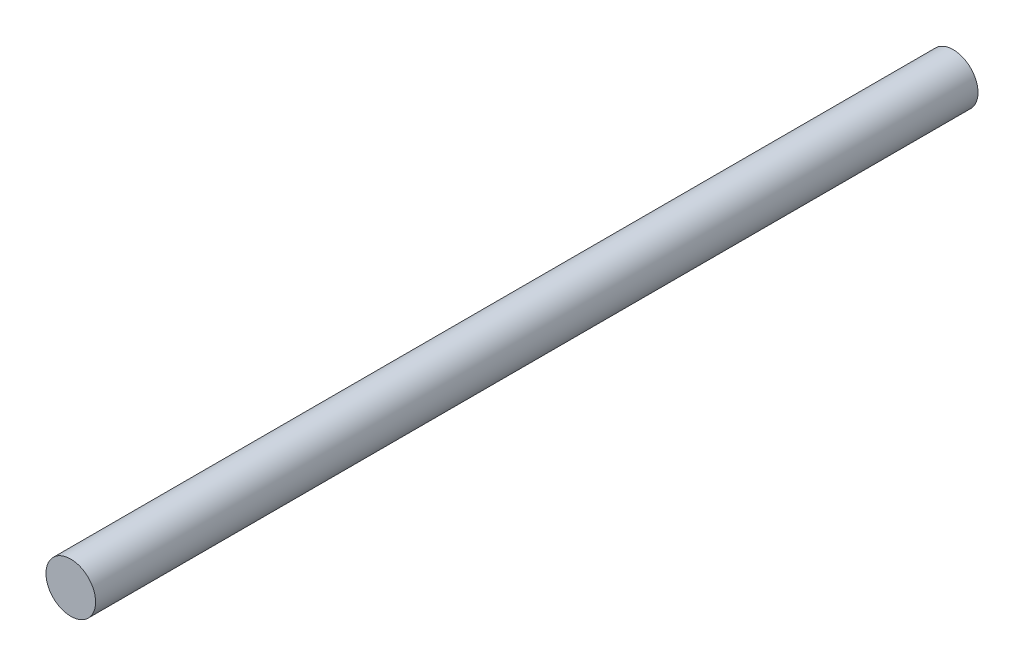
ISO-10303-21;
HEADER;
FILE_DESCRIPTION(('STEP AP214'),'2;1');
FILE_NAME('part.step','',(''),(''),'','','');
FILE_SCHEMA(('AUTOMOTIVE_DESIGN { 1 0 10303 214 1 1 1 1 }'));
ENDSEC;
DATA;
#1=APPLICATION_CONTEXT('core data for automotive mechanical design processes');
#2=APPLICATION_PROTOCOL_DEFINITION('international standard','automotive_design',2000,#1);
#3=PRODUCT_CONTEXT('',#1,'mechanical');
#4=PRODUCT('Part','Part','',(#3));
#5=PRODUCT_RELATED_PRODUCT_CATEGORY('part','',(#4));
#6=PRODUCT_DEFINITION_FORMATION('','',#4);
#7=PRODUCT_DEFINITION_CONTEXT('part definition',#1,'design');
#8=PRODUCT_DEFINITION('design','',#6,#7);
#9=PRODUCT_DEFINITION_SHAPE('','',#8);
#10=(LENGTH_UNIT() NAMED_UNIT(*) SI_UNIT(.MILLI.,.METRE.));
#11=(NAMED_UNIT(*) PLANE_ANGLE_UNIT() SI_UNIT($,.RADIAN.));
#12=(NAMED_UNIT(*) SI_UNIT($,.STERADIAN.) SOLID_ANGLE_UNIT());
#13=UNCERTAINTY_MEASURE_WITH_UNIT(LENGTH_MEASURE(1.E-05),#10,'distance_accuracy_value','');
#14=(GEOMETRIC_REPRESENTATION_CONTEXT(3) GLOBAL_UNCERTAINTY_ASSIGNED_CONTEXT((#13)) GLOBAL_UNIT_ASSIGNED_CONTEXT((#10,
#11,#12)) REPRESENTATION_CONTEXT('',''));
#15=CARTESIAN_POINT('',(0.,0.,0.));
#16=DIRECTION('',(0.,0.,1.));
#17=DIRECTION('',(1.,0.,0.));
#18=AXIS2_PLACEMENT_3D('',#15,#16,#17);
#19=CARTESIAN_POINT('',(0.,0.,8.));
#20=DIRECTION('',(0.,0.,1.));
#21=DIRECTION('',(1.,0.,0.));
#22=AXIS2_PLACEMENT_3D('',#19,#20,#21);
#23=PLANE('',#22);
#24=CARTESIAN_POINT('',(0.,0.,8.));
#25=DIRECTION('',(0.,0.,1.));
#26=DIRECTION('',(1.,0.,0.));
#27=AXIS2_PLACEMENT_3D('',#24,#25,#26);
#28=CIRCLE('',#27,0.225);
#29=CARTESIAN_POINT('',(0.225,0.,8.));
#30=VERTEX_POINT('',#29);
#31=EDGE_CURVE('E17',#30,#30,#28,.F.);
#32=ORIENTED_EDGE('',*,*,#31,.F.);
#33=EDGE_LOOP('',(#32));
#34=FACE_BOUND('',#33,.T.);
#35=ADVANCED_FACE('F14',(#34),#23,.T.);
#36=CARTESIAN_POINT('',(0.,0.,0.));
#37=DIRECTION('',(0.,0.,1.));
#38=DIRECTION('',(1.,0.,0.));
#39=AXIS2_PLACEMENT_3D('',#36,#37,#38);
#40=PLANE('',#39);
#41=CARTESIAN_POINT('',(0.,0.,0.));
#42=DIRECTION('',(0.,0.,1.));
#43=DIRECTION('',(1.,0.,0.));
#44=AXIS2_PLACEMENT_3D('',#41,#42,#43);
#45=CIRCLE('',#44,0.225);
#46=CARTESIAN_POINT('',(0.225,0.,0.));
#47=VERTEX_POINT('',#46);
#48=EDGE_CURVE('E9',#47,#47,#45,.T.);
#49=ORIENTED_EDGE('',*,*,#48,.F.);
#50=EDGE_LOOP('',(#49));
#51=FACE_BOUND('',#50,.T.);
#52=ADVANCED_FACE('F29',(#51),#40,.F.);
#53=CARTESIAN_POINT('',(0.,0.,0.));
#54=DIRECTION('',(0.,0.,1.));
#55=DIRECTION('',(1.,0.,0.));
#56=AXIS2_PLACEMENT_3D('',#53,#54,#55);
#57=CYLINDRICAL_SURFACE('',#56,0.225);
#58=ORIENTED_EDGE('',*,*,#31,.T.);
#59=EDGE_LOOP('',(#58));
#60=FACE_BOUND('',#59,.T.);
#61=ORIENTED_EDGE('',*,*,#48,.T.);
#62=EDGE_LOOP('',(#61));
#63=FACE_BOUND('',#62,.T.);
#64=ADVANCED_FACE('F26',(#60,#63),#57,.T.);
#65=CLOSED_SHELL('',(#35,#52,#64));
#66=MANIFOLD_SOLID_BREP('B1',#65);
#67=ADVANCED_BREP_SHAPE_REPRESENTATION('',(#18,#66),#14);
#68=SHAPE_DEFINITION_REPRESENTATION(#9,#67);
ENDSEC;
END-ISO-10303-21;
